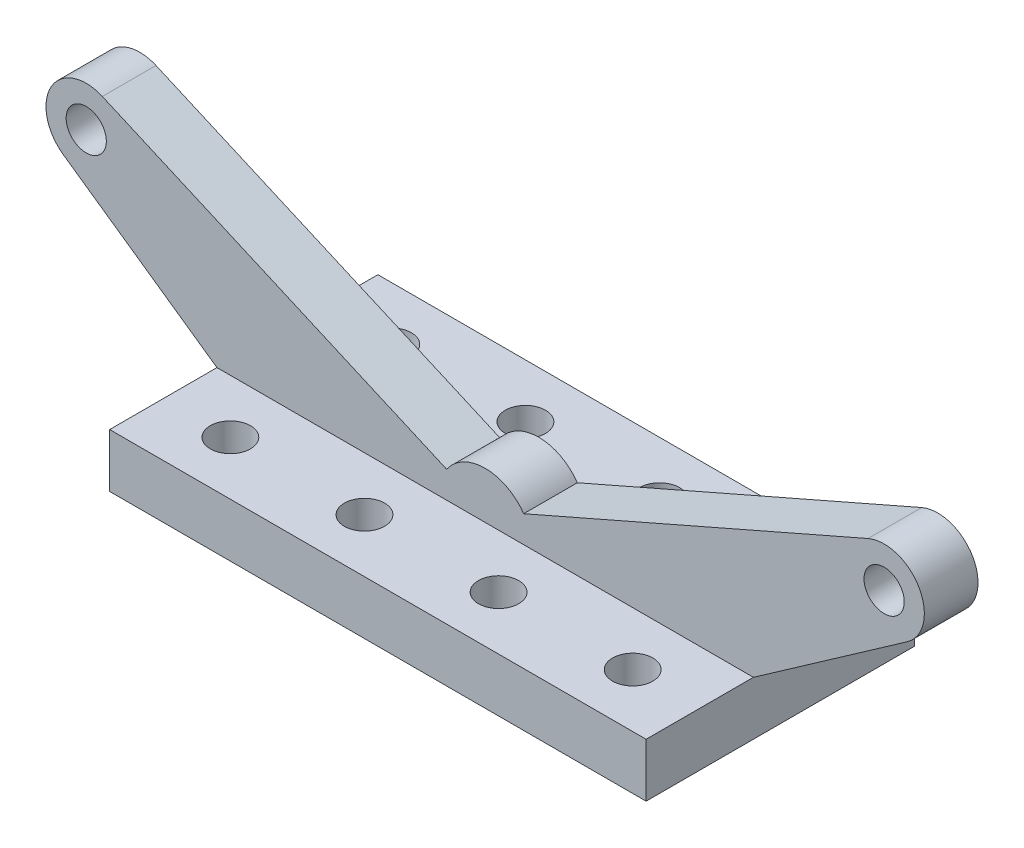
ISO-10303-21;
HEADER;
FILE_DESCRIPTION(('STEP AP214'),'2;1');
FILE_NAME('part.step','',(''),(''),'','','');
FILE_SCHEMA(('AUTOMOTIVE_DESIGN { 1 0 10303 214 1 1 1 1 }'));
ENDSEC;
DATA;
#1=APPLICATION_CONTEXT('core data for automotive mechanical design processes');
#2=APPLICATION_PROTOCOL_DEFINITION('international standard','automotive_design',2000,#1);
#3=PRODUCT_CONTEXT('',#1,'mechanical');
#4=PRODUCT('Part','Part','',(#3));
#5=PRODUCT_RELATED_PRODUCT_CATEGORY('part','',(#4));
#6=PRODUCT_DEFINITION_FORMATION('','',#4);
#7=PRODUCT_DEFINITION_CONTEXT('part definition',#1,'design');
#8=PRODUCT_DEFINITION('design','',#6,#7);
#9=PRODUCT_DEFINITION_SHAPE('','',#8);
#10=(LENGTH_UNIT() NAMED_UNIT(*) SI_UNIT(.MILLI.,.METRE.));
#11=(NAMED_UNIT(*) PLANE_ANGLE_UNIT() SI_UNIT($,.RADIAN.));
#12=(NAMED_UNIT(*) SI_UNIT($,.STERADIAN.) SOLID_ANGLE_UNIT());
#13=UNCERTAINTY_MEASURE_WITH_UNIT(LENGTH_MEASURE(1.E-05),#10,'distance_accuracy_value','');
#14=(GEOMETRIC_REPRESENTATION_CONTEXT(3) GLOBAL_UNCERTAINTY_ASSIGNED_CONTEXT((#13)) GLOBAL_UNIT_ASSIGNED_CONTEXT((#10,
#11,#12)) REPRESENTATION_CONTEXT('',''));
#15=CARTESIAN_POINT('',(0.,0.,0.));
#16=DIRECTION('',(0.,0.,1.));
#17=DIRECTION('',(1.,0.,0.));
#18=AXIS2_PLACEMENT_3D('',#15,#16,#17);
#19=CARTESIAN_POINT('',(0.,20.,0.));
#20=DIRECTION('',(0.,-1.,0.));
#21=DIRECTION('',(0.,0.,-1.));
#22=AXIS2_PLACEMENT_3D('',#19,#20,#21);
#23=PLANE('',#22);
#24=CARTESIAN_POINT('',(75.,20.,30.));
#25=DIRECTION('',(0.,1.,0.));
#26=DIRECTION('',(0.,0.,1.));
#27=AXIS2_PLACEMENT_3D('',#24,#25,#26);
#28=CIRCLE('',#27,7.50000000000001);
#29=CARTESIAN_POINT('',(75.,20.,37.5));
#30=VERTEX_POINT('',#29);
#31=EDGE_CURVE('E217',#30,#30,#28,.T.);
#32=ORIENTED_EDGE('',*,*,#31,.F.);
#33=EDGE_LOOP('',(#32));
#34=FACE_BOUND('',#33,.T.);
#35=CARTESIAN_POINT('',(25.,20.,30.));
#36=DIRECTION('',(0.,1.,0.));
#37=DIRECTION('',(0.,0.,1.));
#38=AXIS2_PLACEMENT_3D('',#35,#36,#37);
#39=CIRCLE('',#38,7.50000000000001);
#40=CARTESIAN_POINT('',(25.,20.,37.5));
#41=VERTEX_POINT('',#40);
#42=EDGE_CURVE('E229',#41,#41,#39,.T.);
#43=ORIENTED_EDGE('',*,*,#42,.F.);
#44=EDGE_LOOP('',(#43));
#45=FACE_BOUND('',#44,.T.);
#46=CARTESIAN_POINT('',(-25.,20.,30.));
#47=DIRECTION('',(0.,1.,0.));
#48=DIRECTION('',(0.,0.,1.));
#49=AXIS2_PLACEMENT_3D('',#46,#47,#48);
#50=CIRCLE('',#49,7.50000000000001);
#51=CARTESIAN_POINT('',(-25.,20.,37.5));
#52=VERTEX_POINT('',#51);
#53=EDGE_CURVE('E241',#52,#52,#50,.T.);
#54=ORIENTED_EDGE('',*,*,#53,.F.);
#55=EDGE_LOOP('',(#54));
#56=FACE_BOUND('',#55,.T.);
#57=CARTESIAN_POINT('',(-75.,20.,30.));
#58=DIRECTION('',(0.,1.,0.));
#59=DIRECTION('',(0.,0.,1.));
#60=AXIS2_PLACEMENT_3D('',#57,#58,#59);
#61=CIRCLE('',#60,7.50000000000001);
#62=CARTESIAN_POINT('',(-75.,20.,37.5));
#63=VERTEX_POINT('',#62);
#64=EDGE_CURVE('E253',#63,#63,#61,.T.);
#65=ORIENTED_EDGE('',*,*,#64,.F.);
#66=EDGE_LOOP('',(#65));
#67=FACE_BOUND('',#66,.T.);
#68=DIRECTION('',(1.,0.,0.));
#69=VECTOR('',#68,1.);
#70=CARTESIAN_POINT('',(-100.,20.,10.));
#71=LINE('',#70,#69);
#72=CARTESIAN_POINT('',(-100.,20.,10.));
#73=VERTEX_POINT('',#72);
#74=CARTESIAN_POINT('',(100.,20.,10.));
#75=VERTEX_POINT('',#74);
#76=EDGE_CURVE('E60',#73,#75,#71,.T.);
#77=ORIENTED_EDGE('',*,*,#76,.F.);
#78=DIRECTION('',(0.,0.,1.));
#79=VECTOR('',#78,1.);
#80=CARTESIAN_POINT('',(-100.,20.,50.));
#81=LINE('',#80,#79);
#82=CARTESIAN_POINT('',(-100.,20.,50.));
#83=VERTEX_POINT('',#82);
#84=EDGE_CURVE('E266',#73,#83,#81,.T.);
#85=ORIENTED_EDGE('',*,*,#84,.T.);
#86=DIRECTION('',(1.,0.,0.));
#87=VECTOR('',#86,1.);
#88=CARTESIAN_POINT('',(-100.,20.,50.));
#89=LINE('',#88,#87);
#90=CARTESIAN_POINT('',(100.,20.,50.));
#91=VERTEX_POINT('',#90);
#92=EDGE_CURVE('E136',#83,#91,#89,.T.);
#93=ORIENTED_EDGE('',*,*,#92,.T.);
#94=DIRECTION('',(0.,0.,-1.));
#95=VECTOR('',#94,1.);
#96=CARTESIAN_POINT('',(100.,20.,50.));
#97=LINE('',#96,#95);
#98=EDGE_CURVE('E133',#91,#75,#97,.T.);
#99=ORIENTED_EDGE('',*,*,#98,.T.);
#100=EDGE_LOOP('',(#77,#85,#93,#99));
#101=FACE_BOUND('',#100,.T.);
#102=ADVANCED_FACE('F45',(#34,#45,#56,#67,#101),#23,.F.);
#103=CARTESIAN_POINT('',(-100.,20.,-50.));
#104=VERTEX_POINT('',#103);
#105=CARTESIAN_POINT('',(-100.,20.,-10.));
#106=VERTEX_POINT('',#105);
#107=EDGE_CURVE('E267',#104,#106,#81,.T.);
#108=ORIENTED_EDGE('',*,*,#107,.T.);
#109=DIRECTION('',(1.,0.,0.));
#110=VECTOR('',#109,1.);
#111=CARTESIAN_POINT('',(-100.,20.,-10.));
#112=LINE('',#111,#110);
#113=CARTESIAN_POINT('',(100.,20.,-10.));
#114=VERTEX_POINT('',#113);
#115=EDGE_CURVE('E186',#106,#114,#112,.T.);
#116=ORIENTED_EDGE('',*,*,#115,.T.);
#117=CARTESIAN_POINT('',(100.,20.,-50.));
#118=VERTEX_POINT('',#117);
#119=EDGE_CURVE('E141',#114,#118,#97,.T.);
#120=ORIENTED_EDGE('',*,*,#119,.T.);
#121=DIRECTION('',(-1.,0.,0.));
#122=VECTOR('',#121,1.);
#123=CARTESIAN_POINT('',(-100.,20.,-50.));
#124=LINE('',#123,#122);
#125=EDGE_CURVE('E140',#118,#104,#124,.T.);
#126=ORIENTED_EDGE('',*,*,#125,.T.);
#127=EDGE_LOOP('',(#108,#116,#120,#126));
#128=FACE_BOUND('',#127,.T.);
#129=CARTESIAN_POINT('',(-75.,20.,-30.));
#130=DIRECTION('',(0.,1.,0.));
#131=DIRECTION('',(0.,0.,1.));
#132=AXIS2_PLACEMENT_3D('',#129,#130,#131);
#133=CIRCLE('',#132,7.50000000000001);
#134=CARTESIAN_POINT('',(-75.,20.,-22.5));
#135=VERTEX_POINT('',#134);
#136=EDGE_CURVE('E259',#135,#135,#133,.T.);
#137=ORIENTED_EDGE('',*,*,#136,.F.);
#138=EDGE_LOOP('',(#137));
#139=FACE_BOUND('',#138,.T.);
#140=CARTESIAN_POINT('',(-25.,20.,-30.));
#141=DIRECTION('',(0.,1.,0.));
#142=DIRECTION('',(0.,0.,1.));
#143=AXIS2_PLACEMENT_3D('',#140,#141,#142);
#144=CIRCLE('',#143,7.50000000000001);
#145=CARTESIAN_POINT('',(-25.,20.,-22.5));
#146=VERTEX_POINT('',#145);
#147=EDGE_CURVE('E247',#146,#146,#144,.T.);
#148=ORIENTED_EDGE('',*,*,#147,.F.);
#149=EDGE_LOOP('',(#148));
#150=FACE_BOUND('',#149,.T.);
#151=CARTESIAN_POINT('',(25.,20.,-30.));
#152=DIRECTION('',(0.,1.,0.));
#153=DIRECTION('',(0.,0.,1.));
#154=AXIS2_PLACEMENT_3D('',#151,#152,#153);
#155=CIRCLE('',#154,7.50000000000001);
#156=CARTESIAN_POINT('',(25.,20.,-22.5));
#157=VERTEX_POINT('',#156);
#158=EDGE_CURVE('E235',#157,#157,#155,.T.);
#159=ORIENTED_EDGE('',*,*,#158,.F.);
#160=EDGE_LOOP('',(#159));
#161=FACE_BOUND('',#160,.T.);
#162=CARTESIAN_POINT('',(75.,20.,-30.));
#163=DIRECTION('',(0.,1.,0.));
#164=DIRECTION('',(0.,0.,1.));
#165=AXIS2_PLACEMENT_3D('',#162,#163,#164);
#166=CIRCLE('',#165,7.50000000000001);
#167=CARTESIAN_POINT('',(75.,20.,-22.5));
#168=VERTEX_POINT('',#167);
#169=EDGE_CURVE('E223',#168,#168,#166,.T.);
#170=ORIENTED_EDGE('',*,*,#169,.F.);
#171=EDGE_LOOP('',(#170));
#172=FACE_BOUND('',#171,.T.);
#173=ADVANCED_FACE('F297',(#128,#139,#150,#161,#172),#23,.F.);
#174=CARTESIAN_POINT('',(0.,0.,0.));
#175=DIRECTION('',(0.,-1.,0.));
#176=DIRECTION('',(0.,0.,-1.));
#177=AXIS2_PLACEMENT_3D('',#174,#175,#176);
#178=PLANE('',#177);
#179=CARTESIAN_POINT('',(75.,0.,-30.));
#180=DIRECTION('',(0.,1.,0.));
#181=DIRECTION('',(0.,0.,1.));
#182=AXIS2_PLACEMENT_3D('',#179,#180,#181);
#183=CIRCLE('',#182,7.50000000000001);
#184=CARTESIAN_POINT('',(75.,0.,-22.5));
#185=VERTEX_POINT('',#184);
#186=EDGE_CURVE('E220',#185,#185,#183,.T.);
#187=ORIENTED_EDGE('',*,*,#186,.T.);
#188=EDGE_LOOP('',(#187));
#189=FACE_BOUND('',#188,.T.);
#190=CARTESIAN_POINT('',(25.,0.,-30.));
#191=DIRECTION('',(0.,1.,0.));
#192=DIRECTION('',(0.,0.,1.));
#193=AXIS2_PLACEMENT_3D('',#190,#191,#192);
#194=CIRCLE('',#193,7.50000000000001);
#195=CARTESIAN_POINT('',(25.,0.,-22.5));
#196=VERTEX_POINT('',#195);
#197=EDGE_CURVE('E232',#196,#196,#194,.T.);
#198=ORIENTED_EDGE('',*,*,#197,.T.);
#199=EDGE_LOOP('',(#198));
#200=FACE_BOUND('',#199,.T.);
#201=CARTESIAN_POINT('',(-25.,0.,-30.));
#202=DIRECTION('',(0.,1.,0.));
#203=DIRECTION('',(0.,0.,1.));
#204=AXIS2_PLACEMENT_3D('',#201,#202,#203);
#205=CIRCLE('',#204,7.50000000000001);
#206=CARTESIAN_POINT('',(-25.,0.,-22.5));
#207=VERTEX_POINT('',#206);
#208=EDGE_CURVE('E244',#207,#207,#205,.T.);
#209=ORIENTED_EDGE('',*,*,#208,.T.);
#210=EDGE_LOOP('',(#209));
#211=FACE_BOUND('',#210,.T.);
#212=CARTESIAN_POINT('',(-75.,0.,-30.));
#213=DIRECTION('',(0.,1.,0.));
#214=DIRECTION('',(0.,0.,1.));
#215=AXIS2_PLACEMENT_3D('',#212,#213,#214);
#216=CIRCLE('',#215,7.50000000000001);
#217=CARTESIAN_POINT('',(-75.,0.,-22.5));
#218=VERTEX_POINT('',#217);
#219=EDGE_CURVE('E256',#218,#218,#216,.T.);
#220=ORIENTED_EDGE('',*,*,#219,.T.);
#221=EDGE_LOOP('',(#220));
#222=FACE_BOUND('',#221,.T.);
#223=DIRECTION('',(0.,0.,-1.));
#224=VECTOR('',#223,1.);
#225=CARTESIAN_POINT('',(100.,0.,50.));
#226=LINE('',#225,#224);
#227=CARTESIAN_POINT('',(100.,0.,50.));
#228=VERTEX_POINT('',#227);
#229=CARTESIAN_POINT('',(100.,0.,-50.));
#230=VERTEX_POINT('',#229);
#231=EDGE_CURVE('E262',#228,#230,#226,.T.);
#232=ORIENTED_EDGE('',*,*,#231,.F.);
#233=DIRECTION('',(1.,0.,0.));
#234=VECTOR('',#233,1.);
#235=CARTESIAN_POINT('',(-100.,0.,50.));
#236=LINE('',#235,#234);
#237=CARTESIAN_POINT('',(-100.,0.,50.));
#238=VERTEX_POINT('',#237);
#239=EDGE_CURVE('E276',#238,#228,#236,.T.);
#240=ORIENTED_EDGE('',*,*,#239,.F.);
#241=DIRECTION('',(0.,0.,1.));
#242=VECTOR('',#241,1.);
#243=CARTESIAN_POINT('',(-100.,0.,50.));
#244=LINE('',#243,#242);
#245=CARTESIAN_POINT('',(-100.,0.,-50.));
#246=VERTEX_POINT('',#245);
#247=EDGE_CURVE('E274',#246,#238,#244,.T.);
#248=ORIENTED_EDGE('',*,*,#247,.F.);
#249=DIRECTION('',(-1.,0.,0.));
#250=VECTOR('',#249,1.);
#251=CARTESIAN_POINT('',(-100.,0.,-50.));
#252=LINE('',#251,#250);
#253=EDGE_CURVE('E272',#230,#246,#252,.T.);
#254=ORIENTED_EDGE('',*,*,#253,.F.);
#255=EDGE_LOOP('',(#232,#240,#248,#254));
#256=FACE_BOUND('',#255,.T.);
#257=CARTESIAN_POINT('',(-75.,0.,30.));
#258=DIRECTION('',(0.,1.,0.));
#259=DIRECTION('',(0.,0.,1.));
#260=AXIS2_PLACEMENT_3D('',#257,#258,#259);
#261=CIRCLE('',#260,7.50000000000001);
#262=CARTESIAN_POINT('',(-75.,0.,37.5));
#263=VERTEX_POINT('',#262);
#264=EDGE_CURVE('E250',#263,#263,#261,.T.);
#265=ORIENTED_EDGE('',*,*,#264,.T.);
#266=EDGE_LOOP('',(#265));
#267=FACE_BOUND('',#266,.T.);
#268=CARTESIAN_POINT('',(-25.,0.,30.));
#269=DIRECTION('',(0.,1.,0.));
#270=DIRECTION('',(0.,0.,1.));
#271=AXIS2_PLACEMENT_3D('',#268,#269,#270);
#272=CIRCLE('',#271,7.50000000000001);
#273=CARTESIAN_POINT('',(-25.,0.,37.5));
#274=VERTEX_POINT('',#273);
#275=EDGE_CURVE('E238',#274,#274,#272,.T.);
#276=ORIENTED_EDGE('',*,*,#275,.T.);
#277=EDGE_LOOP('',(#276));
#278=FACE_BOUND('',#277,.T.);
#279=CARTESIAN_POINT('',(25.,0.,30.));
#280=DIRECTION('',(0.,1.,0.));
#281=DIRECTION('',(0.,0.,1.));
#282=AXIS2_PLACEMENT_3D('',#279,#280,#281);
#283=CIRCLE('',#282,7.50000000000001);
#284=CARTESIAN_POINT('',(25.,0.,37.5));
#285=VERTEX_POINT('',#284);
#286=EDGE_CURVE('E226',#285,#285,#283,.T.);
#287=ORIENTED_EDGE('',*,*,#286,.T.);
#288=EDGE_LOOP('',(#287));
#289=FACE_BOUND('',#288,.T.);
#290=CARTESIAN_POINT('',(75.,0.,30.));
#291=DIRECTION('',(0.,1.,0.));
#292=DIRECTION('',(0.,0.,1.));
#293=AXIS2_PLACEMENT_3D('',#290,#291,#292);
#294=CIRCLE('',#293,7.50000000000001);
#295=CARTESIAN_POINT('',(75.,0.,37.5));
#296=VERTEX_POINT('',#295);
#297=EDGE_CURVE('E151',#296,#296,#294,.T.);
#298=ORIENTED_EDGE('',*,*,#297,.T.);
#299=EDGE_LOOP('',(#298));
#300=FACE_BOUND('',#299,.T.);
#301=ADVANCED_FACE('F291',(#189,#200,#211,#222,#256,#267,#278,#289,#300),#178,.T.);
#302=CARTESIAN_POINT('',(100.,20.,50.));
#303=DIRECTION('',(-1.,0.,0.));
#304=DIRECTION('',(0.,0.,1.));
#305=AXIS2_PLACEMENT_3D('',#302,#303,#304);
#306=PLANE('',#305);
#307=ORIENTED_EDGE('',*,*,#231,.T.);
#308=DIRECTION('',(0.,-1.,0.));
#309=VECTOR('',#308,1.);
#310=CARTESIAN_POINT('',(100.,20.,-50.));
#311=LINE('',#310,#309);
#312=EDGE_CURVE('E13',#118,#230,#311,.T.);
#313=ORIENTED_EDGE('',*,*,#312,.F.);
#314=ORIENTED_EDGE('',*,*,#119,.F.);
#315=DIRECTION('',(0.,0.,-1.));
#316=VECTOR('',#315,1.);
#317=CARTESIAN_POINT('',(100.,20.,10.));
#318=LINE('',#317,#316);
#319=EDGE_CURVE('E145',#75,#114,#318,.T.);
#320=ORIENTED_EDGE('',*,*,#319,.F.);
#321=ORIENTED_EDGE('',*,*,#98,.F.);
#322=DIRECTION('',(0.,-1.,0.));
#323=VECTOR('',#322,1.);
#324=CARTESIAN_POINT('',(100.,20.,50.));
#325=LINE('',#324,#323);
#326=EDGE_CURVE('E270',#91,#228,#325,.T.);
#327=ORIENTED_EDGE('',*,*,#326,.T.);
#328=EDGE_LOOP('',(#307,#313,#314,#320,#321,#327));
#329=FACE_BOUND('',#328,.T.);
#330=ADVANCED_FACE('F47',(#329),#306,.F.);
#331=CARTESIAN_POINT('',(-100.,20.,-50.));
#332=DIRECTION('',(0.,0.,1.));
#333=DIRECTION('',(1.,0.,0.));
#334=AXIS2_PLACEMENT_3D('',#331,#332,#333);
#335=PLANE('',#334);
#336=ORIENTED_EDGE('',*,*,#253,.T.);
#337=DIRECTION('',(0.,-1.,0.));
#338=VECTOR('',#337,1.);
#339=CARTESIAN_POINT('',(-100.,20.,-50.));
#340=LINE('',#339,#338);
#341=EDGE_CURVE('E53',#104,#246,#340,.T.);
#342=ORIENTED_EDGE('',*,*,#341,.F.);
#343=ORIENTED_EDGE('',*,*,#125,.F.);
#344=ORIENTED_EDGE('',*,*,#312,.T.);
#345=EDGE_LOOP('',(#336,#342,#343,#344));
#346=FACE_BOUND('',#345,.T.);
#347=ADVANCED_FACE('F295',(#346),#335,.F.);
#348=CARTESIAN_POINT('',(-100.,20.,50.));
#349=DIRECTION('',(1.,0.,0.));
#350=DIRECTION('',(0.,0.,-1.));
#351=AXIS2_PLACEMENT_3D('',#348,#349,#350);
#352=PLANE('',#351);
#353=ORIENTED_EDGE('',*,*,#247,.T.);
#354=DIRECTION('',(0.,-1.,0.));
#355=VECTOR('',#354,1.);
#356=CARTESIAN_POINT('',(-100.,20.,50.));
#357=LINE('',#356,#355);
#358=EDGE_CURVE('E279',#83,#238,#357,.T.);
#359=ORIENTED_EDGE('',*,*,#358,.F.);
#360=ORIENTED_EDGE('',*,*,#84,.F.);
#361=DIRECTION('',(0.,0.,-1.));
#362=VECTOR('',#361,1.);
#363=CARTESIAN_POINT('',(-100.,20.,10.));
#364=LINE('',#363,#362);
#365=EDGE_CURVE('E67',#73,#106,#364,.T.);
#366=ORIENTED_EDGE('',*,*,#365,.T.);
#367=ORIENTED_EDGE('',*,*,#107,.F.);
#368=ORIENTED_EDGE('',*,*,#341,.T.);
#369=EDGE_LOOP('',(#353,#359,#360,#366,#367,#368));
#370=FACE_BOUND('',#369,.T.);
#371=ADVANCED_FACE('F284',(#370),#352,.F.);
#372=CARTESIAN_POINT('',(-100.,20.,50.));
#373=DIRECTION('',(0.,0.,-1.));
#374=DIRECTION('',(-1.,0.,0.));
#375=AXIS2_PLACEMENT_3D('',#372,#373,#374);
#376=PLANE('',#375);
#377=ORIENTED_EDGE('',*,*,#239,.T.);
#378=ORIENTED_EDGE('',*,*,#326,.F.);
#379=ORIENTED_EDGE('',*,*,#92,.F.);
#380=ORIENTED_EDGE('',*,*,#358,.T.);
#381=EDGE_LOOP('',(#377,#378,#379,#380));
#382=FACE_BOUND('',#381,.T.);
#383=ADVANCED_FACE('F294',(#382),#376,.F.);
#384=CARTESIAN_POINT('',(-75.,20.,-30.));
#385=DIRECTION('',(0.,-1.,0.));
#386=DIRECTION('',(0.,0.,-1.));
#387=AXIS2_PLACEMENT_3D('',#384,#385,#386);
#388=CYLINDRICAL_SURFACE('',#387,7.50000000000001);
#389=ORIENTED_EDGE('',*,*,#136,.T.);
#390=EDGE_LOOP('',(#389));
#391=FACE_BOUND('',#390,.T.);
#392=ORIENTED_EDGE('',*,*,#219,.F.);
#393=EDGE_LOOP('',(#392));
#394=FACE_BOUND('',#393,.T.);
#395=ADVANCED_FACE('F352',(#391,#394),#388,.F.);
#396=CARTESIAN_POINT('',(-75.,20.,30.));
#397=DIRECTION('',(0.,-1.,0.));
#398=DIRECTION('',(0.,0.,-1.));
#399=AXIS2_PLACEMENT_3D('',#396,#397,#398);
#400=CYLINDRICAL_SURFACE('',#399,7.50000000000001);
#401=ORIENTED_EDGE('',*,*,#64,.T.);
#402=EDGE_LOOP('',(#401));
#403=FACE_BOUND('',#402,.T.);
#404=ORIENTED_EDGE('',*,*,#264,.F.);
#405=EDGE_LOOP('',(#404));
#406=FACE_BOUND('',#405,.T.);
#407=ADVANCED_FACE('F441',(#403,#406),#400,.F.);
#408=CARTESIAN_POINT('',(-25.,20.,-30.));
#409=DIRECTION('',(0.,-1.,0.));
#410=DIRECTION('',(0.,0.,-1.));
#411=AXIS2_PLACEMENT_3D('',#408,#409,#410);
#412=CYLINDRICAL_SURFACE('',#411,7.50000000000001);
#413=ORIENTED_EDGE('',*,*,#147,.T.);
#414=EDGE_LOOP('',(#413));
#415=FACE_BOUND('',#414,.T.);
#416=ORIENTED_EDGE('',*,*,#208,.F.);
#417=EDGE_LOOP('',(#416));
#418=FACE_BOUND('',#417,.T.);
#419=ADVANCED_FACE('F431',(#415,#418),#412,.F.);
#420=CARTESIAN_POINT('',(-25.,20.,30.));
#421=DIRECTION('',(0.,-1.,0.));
#422=DIRECTION('',(0.,0.,-1.));
#423=AXIS2_PLACEMENT_3D('',#420,#421,#422);
#424=CYLINDRICAL_SURFACE('',#423,7.50000000000001);
#425=ORIENTED_EDGE('',*,*,#53,.T.);
#426=EDGE_LOOP('',(#425));
#427=FACE_BOUND('',#426,.T.);
#428=ORIENTED_EDGE('',*,*,#275,.F.);
#429=EDGE_LOOP('',(#428));
#430=FACE_BOUND('',#429,.T.);
#431=ADVANCED_FACE('F421',(#427,#430),#424,.F.);
#432=CARTESIAN_POINT('',(25.,20.,-30.));
#433=DIRECTION('',(0.,-1.,0.));
#434=DIRECTION('',(0.,0.,-1.));
#435=AXIS2_PLACEMENT_3D('',#432,#433,#434);
#436=CYLINDRICAL_SURFACE('',#435,7.50000000000001);
#437=ORIENTED_EDGE('',*,*,#158,.T.);
#438=EDGE_LOOP('',(#437));
#439=FACE_BOUND('',#438,.T.);
#440=ORIENTED_EDGE('',*,*,#197,.F.);
#441=EDGE_LOOP('',(#440));
#442=FACE_BOUND('',#441,.T.);
#443=ADVANCED_FACE('F411',(#439,#442),#436,.F.);
#444=CARTESIAN_POINT('',(25.,20.,30.));
#445=DIRECTION('',(0.,-1.,0.));
#446=DIRECTION('',(0.,0.,-1.));
#447=AXIS2_PLACEMENT_3D('',#444,#445,#446);
#448=CYLINDRICAL_SURFACE('',#447,7.50000000000001);
#449=ORIENTED_EDGE('',*,*,#42,.T.);
#450=EDGE_LOOP('',(#449));
#451=FACE_BOUND('',#450,.T.);
#452=ORIENTED_EDGE('',*,*,#286,.F.);
#453=EDGE_LOOP('',(#452));
#454=FACE_BOUND('',#453,.T.);
#455=ADVANCED_FACE('F401',(#451,#454),#448,.F.);
#456=CARTESIAN_POINT('',(75.,20.,-30.));
#457=DIRECTION('',(0.,-1.,0.));
#458=DIRECTION('',(0.,0.,-1.));
#459=AXIS2_PLACEMENT_3D('',#456,#457,#458);
#460=CYLINDRICAL_SURFACE('',#459,7.50000000000001);
#461=ORIENTED_EDGE('',*,*,#169,.T.);
#462=EDGE_LOOP('',(#461));
#463=FACE_BOUND('',#462,.T.);
#464=ORIENTED_EDGE('',*,*,#186,.F.);
#465=EDGE_LOOP('',(#464));
#466=FACE_BOUND('',#465,.T.);
#467=ADVANCED_FACE('F390',(#463,#466),#460,.F.);
#468=CARTESIAN_POINT('',(75.,20.,30.));
#469=DIRECTION('',(0.,-1.,0.));
#470=DIRECTION('',(0.,0.,-1.));
#471=AXIS2_PLACEMENT_3D('',#468,#469,#470);
#472=CYLINDRICAL_SURFACE('',#471,7.50000000000001);
#473=ORIENTED_EDGE('',*,*,#31,.T.);
#474=EDGE_LOOP('',(#473));
#475=FACE_BOUND('',#474,.T.);
#476=ORIENTED_EDGE('',*,*,#297,.F.);
#477=EDGE_LOOP('',(#476));
#478=FACE_BOUND('',#477,.T.);
#479=ADVANCED_FACE('F386',(#475,#478),#472,.F.);
#480=CARTESIAN_POINT('',(148.736996554964,72.4376312089078,10.));
#481=DIRECTION('',(0.,0.,-1.));
#482=DIRECTION('',(-1.,0.,0.));
#483=AXIS2_PLACEMENT_3D('',#480,#481,#482);
#484=PLANE('',#483);
#485=ORIENTED_EDGE('',*,*,#76,.T.);
#486=DIRECTION('',(0.819152044288995,0.573576436351041,0.));
#487=VECTOR('',#486,1.);
#488=CARTESIAN_POINT('',(100.,20.,10.));
#489=LINE('',#488,#487);
#490=CARTESIAN_POINT('',(157.34064310023,60.1503505445729,10.));
#491=VERTEX_POINT('',#490);
#492=EDGE_CURVE('E155',#75,#491,#489,.T.);
#493=ORIENTED_EDGE('',*,*,#492,.T.);
#494=CARTESIAN_POINT('',(148.736996554964,72.4376312089078,10.));
#495=DIRECTION('',(0.,0.,1.));
#496=DIRECTION('',(-1.,0.,0.));
#497=AXIS2_PLACEMENT_3D('',#494,#495,#496);
#498=CIRCLE('',#497,15.);
#499=CARTESIAN_POINT('',(142.722823192311,86.179163829542,10.));
#500=VERTEX_POINT('',#499);
#501=EDGE_CURVE('E160',#491,#500,#498,.T.);
#502=ORIENTED_EDGE('',*,*,#501,.T.);
#503=DIRECTION('',(-0.916102174708944,-0.400944890843545,0.));
#504=VECTOR('',#503,1.);
#505=CARTESIAN_POINT('',(142.722823192311,86.179163829542,10.));
#506=LINE('',#505,#504);
#507=CARTESIAN_POINT('',(14.3614066163451,30.,10.));
#508=VERTEX_POINT('',#507);
#509=EDGE_CURVE('E177',#500,#508,#506,.T.);
#510=ORIENTED_EDGE('',*,*,#509,.T.);
#511=CARTESIAN_POINT('',(0.,20.,10.));
#512=DIRECTION('',(0.,0.,1.));
#513=DIRECTION('',(1.,0.,0.));
#514=AXIS2_PLACEMENT_3D('',#511,#512,#513);
#515=CIRCLE('',#514,17.5);
#516=CARTESIAN_POINT('',(-14.3614066163451,30.,10.));
#517=VERTEX_POINT('',#516);
#518=EDGE_CURVE('E179',#508,#517,#515,.T.);
#519=ORIENTED_EDGE('',*,*,#518,.T.);
#520=DIRECTION('',(-0.916102174708944,0.400944890843545,0.));
#521=VECTOR('',#520,1.);
#522=CARTESIAN_POINT('',(-142.722823192311,86.179163829542,10.));
#523=LINE('',#522,#521);
#524=CARTESIAN_POINT('',(-142.722823192311,86.179163829542,10.));
#525=VERTEX_POINT('',#524);
#526=EDGE_CURVE('E181',#517,#525,#523,.T.);
#527=ORIENTED_EDGE('',*,*,#526,.T.);
#528=CARTESIAN_POINT('',(-148.736996554964,72.4376312089078,10.));
#529=DIRECTION('',(0.,0.,1.));
#530=DIRECTION('',(1.,0.,0.));
#531=AXIS2_PLACEMENT_3D('',#528,#529,#530);
#532=CIRCLE('',#531,15.);
#533=CARTESIAN_POINT('',(-157.34064310023,60.1503505445729,10.));
#534=VERTEX_POINT('',#533);
#535=EDGE_CURVE('E183',#525,#534,#532,.T.);
#536=ORIENTED_EDGE('',*,*,#535,.T.);
#537=DIRECTION('',(0.819152044288995,-0.573576436351041,0.));
#538=VECTOR('',#537,1.);
#539=CARTESIAN_POINT('',(-100.,20.,10.));
#540=LINE('',#539,#538);
#541=EDGE_CURVE('E166',#534,#73,#540,.T.);
#542=ORIENTED_EDGE('',*,*,#541,.T.);
#543=EDGE_LOOP('',(#485,#493,#502,#510,#519,#527,#536,#542));
#544=FACE_BOUND('',#543,.T.);
#545=CARTESIAN_POINT('',(-148.736996554964,72.4376312089078,10.));
#546=DIRECTION('',(0.,0.,1.));
#547=DIRECTION('',(1.,0.,0.));
#548=AXIS2_PLACEMENT_3D('',#545,#546,#547);
#549=CIRCLE('',#548,7.50000000000001);
#550=CARTESIAN_POINT('',(-141.236996554964,72.4376312089078,10.));
#551=VERTEX_POINT('',#550);
#552=EDGE_CURVE('E189',#551,#551,#549,.T.);
#553=ORIENTED_EDGE('',*,*,#552,.F.);
#554=EDGE_LOOP('',(#553));
#555=FACE_BOUND('',#554,.T.);
#556=CARTESIAN_POINT('',(148.736996554964,72.4376312089078,10.));
#557=DIRECTION('',(0.,0.,1.));
#558=DIRECTION('',(-1.,0.,0.));
#559=AXIS2_PLACEMENT_3D('',#556,#557,#558);
#560=CIRCLE('',#559,7.50000000000001);
#561=CARTESIAN_POINT('',(141.236996554964,72.4376312089078,10.));
#562=VERTEX_POINT('',#561);
#563=EDGE_CURVE('E561',#562,#562,#560,.T.);
#564=ORIENTED_EDGE('',*,*,#563,.F.);
#565=EDGE_LOOP('',(#564));
#566=FACE_BOUND('',#565,.T.);
#567=ADVANCED_FACE('F163',(#544,#555,#566),#484,.F.);
#568=CARTESIAN_POINT('',(148.736996554964,72.4376312089078,-10.));
#569=DIRECTION('',(0.,0.,-1.));
#570=DIRECTION('',(-1.,0.,0.));
#571=AXIS2_PLACEMENT_3D('',#568,#569,#570);
#572=PLANE('',#571);
#573=CARTESIAN_POINT('',(-148.736996554964,72.4376312089078,-10.));
#574=DIRECTION('',(0.,0.,1.));
#575=DIRECTION('',(1.,0.,0.));
#576=AXIS2_PLACEMENT_3D('',#573,#574,#575);
#577=CIRCLE('',#576,7.50000000000001);
#578=CARTESIAN_POINT('',(-141.236996554964,72.4376312089078,-10.));
#579=VERTEX_POINT('',#578);
#580=EDGE_CURVE('E173',#579,#579,#577,.T.);
#581=ORIENTED_EDGE('',*,*,#580,.T.);
#582=EDGE_LOOP('',(#581));
#583=FACE_BOUND('',#582,.T.);
#584=ORIENTED_EDGE('',*,*,#115,.F.);
#585=DIRECTION('',(0.819152044288995,-0.573576436351041,0.));
#586=VECTOR('',#585,1.);
#587=CARTESIAN_POINT('',(-100.,20.,-10.));
#588=LINE('',#587,#586);
#589=CARTESIAN_POINT('',(-157.34064310023,60.1503505445729,-10.));
#590=VERTEX_POINT('',#589);
#591=EDGE_CURVE('E167',#590,#106,#588,.T.);
#592=ORIENTED_EDGE('',*,*,#591,.F.);
#593=CARTESIAN_POINT('',(-148.736996554964,72.4376312089078,-10.));
#594=DIRECTION('',(0.,0.,1.));
#595=DIRECTION('',(1.,0.,0.));
#596=AXIS2_PLACEMENT_3D('',#593,#594,#595);
#597=CIRCLE('',#596,15.);
#598=CARTESIAN_POINT('',(-142.722823192311,86.179163829542,-10.));
#599=VERTEX_POINT('',#598);
#600=EDGE_CURVE('E170',#599,#590,#597,.T.);
#601=ORIENTED_EDGE('',*,*,#600,.F.);
#602=DIRECTION('',(-0.916102174708944,0.400944890843545,0.));
#603=VECTOR('',#602,1.);
#604=CARTESIAN_POINT('',(-142.722823192311,86.179163829542,-10.));
#605=LINE('',#604,#603);
#606=CARTESIAN_POINT('',(-14.3614066163451,30.,-10.));
#607=VERTEX_POINT('',#606);
#608=EDGE_CURVE('E197',#607,#599,#605,.T.);
#609=ORIENTED_EDGE('',*,*,#608,.F.);
#610=CARTESIAN_POINT('',(0.,20.,-10.));
#611=DIRECTION('',(0.,0.,1.));
#612=DIRECTION('',(1.,0.,0.));
#613=AXIS2_PLACEMENT_3D('',#610,#611,#612);
#614=CIRCLE('',#613,17.5);
#615=CARTESIAN_POINT('',(14.3614066163451,30.,-10.));
#616=VERTEX_POINT('',#615);
#617=EDGE_CURVE('E195',#616,#607,#614,.T.);
#618=ORIENTED_EDGE('',*,*,#617,.F.);
#619=DIRECTION('',(-0.916102174708944,-0.400944890843545,0.));
#620=VECTOR('',#619,1.);
#621=CARTESIAN_POINT('',(142.722823192311,86.179163829542,-10.));
#622=LINE('',#621,#620);
#623=CARTESIAN_POINT('',(142.722823192311,86.179163829542,-10.));
#624=VERTEX_POINT('',#623);
#625=EDGE_CURVE('E193',#624,#616,#622,.T.);
#626=ORIENTED_EDGE('',*,*,#625,.F.);
#627=CARTESIAN_POINT('',(148.736996554964,72.4376312089078,-10.));
#628=DIRECTION('',(0.,0.,1.));
#629=DIRECTION('',(-1.,0.,0.));
#630=AXIS2_PLACEMENT_3D('',#627,#628,#629);
#631=CIRCLE('',#630,15.);
#632=CARTESIAN_POINT('',(157.34064310023,60.1503505445729,-10.));
#633=VERTEX_POINT('',#632);
#634=EDGE_CURVE('E191',#633,#624,#631,.T.);
#635=ORIENTED_EDGE('',*,*,#634,.F.);
#636=DIRECTION('',(0.819152044288995,0.573576436351041,0.));
#637=VECTOR('',#636,1.);
#638=CARTESIAN_POINT('',(100.,20.,-10.));
#639=LINE('',#638,#637);
#640=EDGE_CURVE('E188',#114,#633,#639,.T.);
#641=ORIENTED_EDGE('',*,*,#640,.F.);
#642=EDGE_LOOP('',(#584,#592,#601,#609,#618,#626,#635,#641));
#643=FACE_BOUND('',#642,.T.);
#644=CARTESIAN_POINT('',(148.736996554964,72.4376312089078,-10.));
#645=DIRECTION('',(0.,0.,1.));
#646=DIRECTION('',(-1.,0.,0.));
#647=AXIS2_PLACEMENT_3D('',#644,#645,#646);
#648=CIRCLE('',#647,7.50000000000001);
#649=CARTESIAN_POINT('',(141.236996554964,72.4376312089078,-10.));
#650=VERTEX_POINT('',#649);
#651=EDGE_CURVE('E564',#650,#650,#648,.T.);
#652=ORIENTED_EDGE('',*,*,#651,.T.);
#653=EDGE_LOOP('',(#652));
#654=FACE_BOUND('',#653,.T.);
#655=ADVANCED_FACE('F302',(#583,#643,#654),#572,.T.);
#656=CARTESIAN_POINT('',(100.,20.,10.));
#657=DIRECTION('',(-0.573576436351041,0.819152044288995,0.));
#658=DIRECTION('',(-0.819152044288995,-0.573576436351041,0.));
#659=AXIS2_PLACEMENT_3D('',#656,#657,#658);
#660=PLANE('',#659);
#661=ORIENTED_EDGE('',*,*,#640,.T.);
#662=DIRECTION('',(0.,0.,-1.));
#663=VECTOR('',#662,1.);
#664=CARTESIAN_POINT('',(157.34064310023,60.1503505445729,10.));
#665=LINE('',#664,#663);
#666=EDGE_CURVE('E152',#491,#633,#665,.T.);
#667=ORIENTED_EDGE('',*,*,#666,.F.);
#668=ORIENTED_EDGE('',*,*,#492,.F.);
#669=ORIENTED_EDGE('',*,*,#319,.T.);
#670=EDGE_LOOP('',(#661,#667,#668,#669));
#671=FACE_BOUND('',#670,.T.);
#672=ADVANCED_FACE('F156',(#671),#660,.F.);
#673=CARTESIAN_POINT('',(148.736996554964,72.4376312089078,10.));
#674=DIRECTION('',(0.,0.,-1.));
#675=DIRECTION('',(-1.,0.,0.));
#676=AXIS2_PLACEMENT_3D('',#673,#674,#675);
#677=CYLINDRICAL_SURFACE('',#676,15.);
#678=ORIENTED_EDGE('',*,*,#634,.T.);
#679=DIRECTION('',(0.,0.,-1.));
#680=VECTOR('',#679,1.);
#681=CARTESIAN_POINT('',(142.722823192311,86.179163829542,10.));
#682=LINE('',#681,#680);
#683=EDGE_CURVE('E213',#500,#624,#682,.T.);
#684=ORIENTED_EDGE('',*,*,#683,.F.);
#685=ORIENTED_EDGE('',*,*,#501,.F.);
#686=ORIENTED_EDGE('',*,*,#666,.T.);
#687=EDGE_LOOP('',(#678,#684,#685,#686));
#688=FACE_BOUND('',#687,.T.);
#689=ADVANCED_FACE('F308',(#688),#677,.T.);
#690=CARTESIAN_POINT('',(142.722823192311,86.179163829542,10.));
#691=DIRECTION('',(0.400944890843546,-0.916102174708944,0.));
#692=DIRECTION('',(0.916102174708945,0.400944890843546,0.));
#693=AXIS2_PLACEMENT_3D('',#690,#691,#692);
#694=PLANE('',#693);
#695=ORIENTED_EDGE('',*,*,#625,.T.);
#696=DIRECTION('',(0.,0.,-1.));
#697=VECTOR('',#696,1.);
#698=CARTESIAN_POINT('',(14.3614066163451,30.,10.));
#699=LINE('',#698,#697);
#700=EDGE_CURVE('E210',#508,#616,#699,.T.);
#701=ORIENTED_EDGE('',*,*,#700,.F.);
#702=ORIENTED_EDGE('',*,*,#509,.F.);
#703=ORIENTED_EDGE('',*,*,#683,.T.);
#704=EDGE_LOOP('',(#695,#701,#702,#703));
#705=FACE_BOUND('',#704,.T.);
#706=ADVANCED_FACE('F315',(#705),#694,.F.);
#707=CARTESIAN_POINT('',(0.,20.,10.));
#708=DIRECTION('',(0.,0.,-1.));
#709=DIRECTION('',(-1.,0.,0.));
#710=AXIS2_PLACEMENT_3D('',#707,#708,#709);
#711=CYLINDRICAL_SURFACE('',#710,17.5);
#712=ORIENTED_EDGE('',*,*,#617,.T.);
#713=DIRECTION('',(0.,0.,-1.));
#714=VECTOR('',#713,1.);
#715=CARTESIAN_POINT('',(-14.3614066163451,30.,10.));
#716=LINE('',#715,#714);
#717=EDGE_CURVE('E207',#517,#607,#716,.T.);
#718=ORIENTED_EDGE('',*,*,#717,.F.);
#719=ORIENTED_EDGE('',*,*,#518,.F.);
#720=ORIENTED_EDGE('',*,*,#700,.T.);
#721=EDGE_LOOP('',(#712,#718,#719,#720));
#722=FACE_BOUND('',#721,.T.);
#723=ADVANCED_FACE('F318',(#722),#711,.T.);
#724=CARTESIAN_POINT('',(-142.722823192311,86.179163829542,10.));
#725=DIRECTION('',(-0.400944890843546,-0.916102174708944,0.));
#726=DIRECTION('',(0.916102174708945,-0.400944890843546,0.));
#727=AXIS2_PLACEMENT_3D('',#724,#725,#726);
#728=PLANE('',#727);
#729=ORIENTED_EDGE('',*,*,#608,.T.);
#730=DIRECTION('',(0.,0.,-1.));
#731=VECTOR('',#730,1.);
#732=CARTESIAN_POINT('',(-142.722823192311,86.179163829542,10.));
#733=LINE('',#732,#731);
#734=EDGE_CURVE('E204',#525,#599,#733,.T.);
#735=ORIENTED_EDGE('',*,*,#734,.F.);
#736=ORIENTED_EDGE('',*,*,#526,.F.);
#737=ORIENTED_EDGE('',*,*,#717,.T.);
#738=EDGE_LOOP('',(#729,#735,#736,#737));
#739=FACE_BOUND('',#738,.T.);
#740=ADVANCED_FACE('F323',(#739),#728,.F.);
#741=CARTESIAN_POINT('',(-148.736996554964,72.4376312089078,10.));
#742=DIRECTION('',(0.,0.,-1.));
#743=DIRECTION('',(-1.,0.,0.));
#744=AXIS2_PLACEMENT_3D('',#741,#742,#743);
#745=CYLINDRICAL_SURFACE('',#744,15.);
#746=ORIENTED_EDGE('',*,*,#600,.T.);
#747=DIRECTION('',(0.,0.,-1.));
#748=VECTOR('',#747,1.);
#749=CARTESIAN_POINT('',(-157.34064310023,60.1503505445729,10.));
#750=LINE('',#749,#748);
#751=EDGE_CURVE('E201',#534,#590,#750,.T.);
#752=ORIENTED_EDGE('',*,*,#751,.F.);
#753=ORIENTED_EDGE('',*,*,#535,.F.);
#754=ORIENTED_EDGE('',*,*,#734,.T.);
#755=EDGE_LOOP('',(#746,#752,#753,#754));
#756=FACE_BOUND('',#755,.T.);
#757=ADVANCED_FACE('F327',(#756),#745,.T.);
#758=CARTESIAN_POINT('',(-100.,20.,10.));
#759=DIRECTION('',(0.573576436351041,0.819152044288995,0.));
#760=DIRECTION('',(-0.819152044288995,0.573576436351041,0.));
#761=AXIS2_PLACEMENT_3D('',#758,#759,#760);
#762=PLANE('',#761);
#763=ORIENTED_EDGE('',*,*,#591,.T.);
#764=ORIENTED_EDGE('',*,*,#365,.F.);
#765=ORIENTED_EDGE('',*,*,#541,.F.);
#766=ORIENTED_EDGE('',*,*,#751,.T.);
#767=EDGE_LOOP('',(#763,#764,#765,#766));
#768=FACE_BOUND('',#767,.T.);
#769=ADVANCED_FACE('F329',(#768),#762,.F.);
#770=CARTESIAN_POINT('',(-148.736996554964,72.4376312089078,10.));
#771=DIRECTION('',(0.,0.,-1.));
#772=DIRECTION('',(-1.,0.,0.));
#773=AXIS2_PLACEMENT_3D('',#770,#771,#772);
#774=CYLINDRICAL_SURFACE('',#773,7.50000000000001);
#775=ORIENTED_EDGE('',*,*,#552,.T.);
#776=EDGE_LOOP('',(#775));
#777=FACE_BOUND('',#776,.T.);
#778=ORIENTED_EDGE('',*,*,#580,.F.);
#779=EDGE_LOOP('',(#778));
#780=FACE_BOUND('',#779,.T.);
#781=ADVANCED_FACE('F331',(#777,#780),#774,.F.);
#782=CARTESIAN_POINT('',(148.736996554964,72.4376312089078,10.));
#783=DIRECTION('',(0.,0.,-1.));
#784=DIRECTION('',(-1.,0.,0.));
#785=AXIS2_PLACEMENT_3D('',#782,#783,#784);
#786=CYLINDRICAL_SURFACE('',#785,7.50000000000001);
#787=ORIENTED_EDGE('',*,*,#563,.T.);
#788=EDGE_LOOP('',(#787));
#789=FACE_BOUND('',#788,.T.);
#790=ORIENTED_EDGE('',*,*,#651,.F.);
#791=EDGE_LOOP('',(#790));
#792=FACE_BOUND('',#791,.T.);
#793=ADVANCED_FACE('F337',(#789,#792),#786,.F.);
#794=CLOSED_SHELL('',(#102,#173,#301,#330,#347,#371,#383,#395,#407,#419,#431,#443,#455,#467,
#479,#567,#655,#672,#689,#706,#723,#740,#757,#769,#781,#793));
#795=MANIFOLD_SOLID_BREP('B2',#794);
#796=ADVANCED_BREP_SHAPE_REPRESENTATION('',(#18,#795),#14);
#797=SHAPE_DEFINITION_REPRESENTATION(#9,#796);
ENDSEC;
END-ISO-10303-21;
